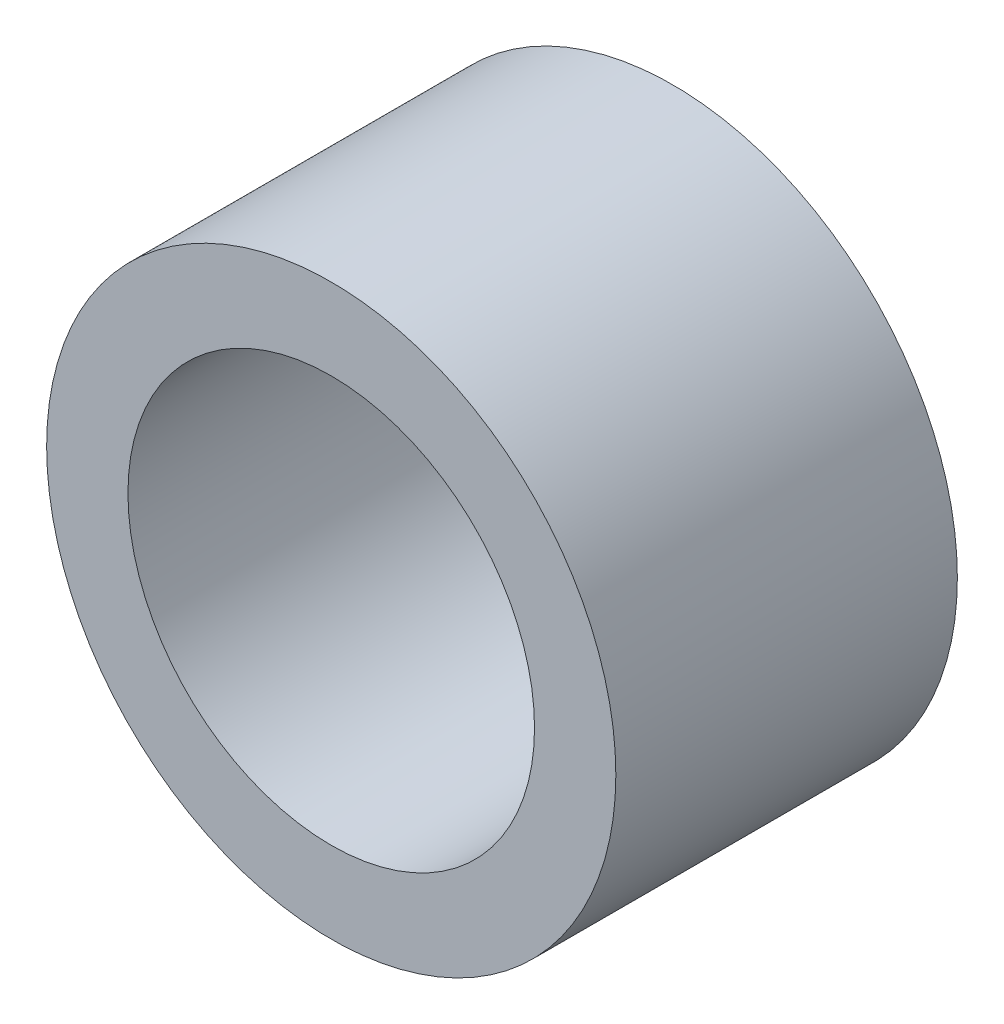
ISO-10303-21;
HEADER;
FILE_DESCRIPTION(('STEP AP214'),'2;1');
FILE_NAME('part.step','',(''),(''),'','','');
FILE_SCHEMA(('AUTOMOTIVE_DESIGN { 1 0 10303 214 1 1 1 1 }'));
ENDSEC;
DATA;
#1=APPLICATION_CONTEXT('core data for automotive mechanical design processes');
#2=APPLICATION_PROTOCOL_DEFINITION('international standard','automotive_design',2000,#1);
#3=PRODUCT_CONTEXT('',#1,'mechanical');
#4=PRODUCT('Part','Part','',(#3));
#5=PRODUCT_RELATED_PRODUCT_CATEGORY('part','',(#4));
#6=PRODUCT_DEFINITION_FORMATION('','',#4);
#7=PRODUCT_DEFINITION_CONTEXT('part definition',#1,'design');
#8=PRODUCT_DEFINITION('design','',#6,#7);
#9=PRODUCT_DEFINITION_SHAPE('','',#8);
#10=(LENGTH_UNIT() NAMED_UNIT(*) SI_UNIT(.MILLI.,.METRE.));
#11=(NAMED_UNIT(*) PLANE_ANGLE_UNIT() SI_UNIT($,.RADIAN.));
#12=(NAMED_UNIT(*) SI_UNIT($,.STERADIAN.) SOLID_ANGLE_UNIT());
#13=UNCERTAINTY_MEASURE_WITH_UNIT(LENGTH_MEASURE(1.E-05),#10,'distance_accuracy_value','');
#14=(GEOMETRIC_REPRESENTATION_CONTEXT(3) GLOBAL_UNCERTAINTY_ASSIGNED_CONTEXT((#13)) GLOBAL_UNIT_ASSIGNED_CONTEXT((#10,
#11,#12)) REPRESENTATION_CONTEXT('',''));
#15=CARTESIAN_POINT('',(0.,0.,0.));
#16=DIRECTION('',(0.,0.,1.));
#17=DIRECTION('',(1.,0.,0.));
#18=AXIS2_PLACEMENT_3D('',#15,#16,#17);
#19=CARTESIAN_POINT('',(0.,0.,21.));
#20=DIRECTION('',(0.,0.,1.));
#21=DIRECTION('',(1.,0.,0.));
#22=AXIS2_PLACEMENT_3D('',#19,#20,#21);
#23=PLANE('',#22);
#24=CARTESIAN_POINT('',(0.,0.,21.));
#25=DIRECTION('',(0.,0.,1.));
#26=DIRECTION('',(1.,0.,0.));
#27=AXIS2_PLACEMENT_3D('',#24,#25,#26);
#28=CIRCLE('',#27,17.5);
#29=CARTESIAN_POINT('',(-17.5,0.,21.));
#30=VERTEX_POINT('',#29);
#31=EDGE_CURVE('E10',#30,#30,#28,.T.);
#32=ORIENTED_EDGE('',*,*,#31,.T.);
#33=EDGE_LOOP('',(#32));
#34=FACE_BOUND('',#33,.T.);
#35=CARTESIAN_POINT('',(0.,0.,21.));
#36=DIRECTION('',(0.,0.,1.));
#37=DIRECTION('',(1.,0.,0.));
#38=AXIS2_PLACEMENT_3D('',#35,#36,#37);
#39=CIRCLE('',#38,12.5);
#40=CARTESIAN_POINT('',(-12.5,0.,21.));
#41=VERTEX_POINT('',#40);
#42=EDGE_CURVE('E42',#41,#41,#39,.T.);
#43=ORIENTED_EDGE('',*,*,#42,.F.);
#44=EDGE_LOOP('',(#43));
#45=FACE_BOUND('',#44,.T.);
#46=ADVANCED_FACE('F31',(#34,#45),#23,.T.);
#47=CARTESIAN_POINT('',(0.,0.,0.));
#48=DIRECTION('',(0.,0.,1.));
#49=DIRECTION('',(1.,0.,0.));
#50=AXIS2_PLACEMENT_3D('',#47,#48,#49);
#51=PLANE('',#50);
#52=CARTESIAN_POINT('',(0.,0.,0.));
#53=DIRECTION('',(0.,0.,1.));
#54=DIRECTION('',(1.,0.,0.));
#55=AXIS2_PLACEMENT_3D('',#52,#53,#54);
#56=CIRCLE('',#55,17.5);
#57=CARTESIAN_POINT('',(-17.5,0.,0.));
#58=VERTEX_POINT('',#57);
#59=EDGE_CURVE('E35',#58,#58,#56,.T.);
#60=ORIENTED_EDGE('',*,*,#59,.F.);
#61=EDGE_LOOP('',(#60));
#62=FACE_BOUND('',#61,.T.);
#63=CARTESIAN_POINT('',(0.,0.,0.));
#64=DIRECTION('',(0.,0.,1.));
#65=DIRECTION('',(1.,0.,0.));
#66=AXIS2_PLACEMENT_3D('',#63,#64,#65);
#67=CIRCLE('',#66,12.5);
#68=CARTESIAN_POINT('',(-12.5,0.,0.));
#69=VERTEX_POINT('',#68);
#70=EDGE_CURVE('E44',#69,#69,#67,.T.);
#71=ORIENTED_EDGE('',*,*,#70,.T.);
#72=EDGE_LOOP('',(#71));
#73=FACE_BOUND('',#72,.T.);
#74=ADVANCED_FACE('F54',(#62,#73),#51,.F.);
#75=CARTESIAN_POINT('',(0.,0.,21.));
#76=DIRECTION('',(0.,0.,-1.));
#77=DIRECTION('',(-1.,0.,0.));
#78=AXIS2_PLACEMENT_3D('',#75,#76,#77);
#79=CYLINDRICAL_SURFACE('',#78,17.5);
#80=CARTESIAN_POINT('',(-17.5,0.,21.));
#81=CARTESIAN_POINT('',(-17.5,0.,20.78125));
#82=CARTESIAN_POINT('',(-17.5,0.,20.5625));
#83=CARTESIAN_POINT('',(-17.5,0.,20.125));
#84=CARTESIAN_POINT('',(-17.5,0.,19.90625));
#85=CARTESIAN_POINT('',(-17.5,0.,19.46875));
#86=CARTESIAN_POINT('',(-17.5,0.,19.25));
#87=CARTESIAN_POINT('',(-17.5,0.,18.8125));
#88=CARTESIAN_POINT('',(-17.5,0.,18.59375));
#89=CARTESIAN_POINT('',(-17.5,0.,18.15625));
#90=CARTESIAN_POINT('',(-17.5,0.,17.9375));
#91=CARTESIAN_POINT('',(-17.5,0.,17.5));
#92=CARTESIAN_POINT('',(-17.5,0.,17.28125));
#93=CARTESIAN_POINT('',(-17.5,0.,16.84375));
#94=CARTESIAN_POINT('',(-17.5,0.,16.625));
#95=CARTESIAN_POINT('',(-17.5,0.,16.1875));
#96=CARTESIAN_POINT('',(-17.5,0.,15.96875));
#97=CARTESIAN_POINT('',(-17.5,0.,15.53125));
#98=CARTESIAN_POINT('',(-17.5,0.,15.3125));
#99=CARTESIAN_POINT('',(-17.5,0.,14.875));
#100=CARTESIAN_POINT('',(-17.5,0.,14.65625));
#101=CARTESIAN_POINT('',(-17.5,0.,14.21875));
#102=CARTESIAN_POINT('',(-17.5,0.,14.));
#103=CARTESIAN_POINT('',(-17.5,0.,13.5625));
#104=CARTESIAN_POINT('',(-17.5,0.,13.34375));
#105=CARTESIAN_POINT('',(-17.5,0.,12.90625));
#106=CARTESIAN_POINT('',(-17.5,0.,12.6875));
#107=CARTESIAN_POINT('',(-17.5,0.,12.25));
#108=CARTESIAN_POINT('',(-17.5,0.,12.03125));
#109=CARTESIAN_POINT('',(-17.5,0.,11.59375));
#110=CARTESIAN_POINT('',(-17.5,0.,11.375));
#111=CARTESIAN_POINT('',(-17.5,0.,10.9375));
#112=CARTESIAN_POINT('',(-17.5,0.,10.71875));
#113=CARTESIAN_POINT('',(-17.5,0.,10.28125));
#114=CARTESIAN_POINT('',(-17.5,0.,10.0625));
#115=CARTESIAN_POINT('',(-17.5,0.,9.625));
#116=CARTESIAN_POINT('',(-17.5,0.,9.40625));
#117=CARTESIAN_POINT('',(-17.5,0.,8.96875));
#118=CARTESIAN_POINT('',(-17.5,0.,8.75));
#119=CARTESIAN_POINT('',(-17.5,0.,8.3125));
#120=CARTESIAN_POINT('',(-17.5,0.,8.09375));
#121=CARTESIAN_POINT('',(-17.5,0.,7.65625));
#122=CARTESIAN_POINT('',(-17.5,0.,7.4375));
#123=CARTESIAN_POINT('',(-17.5,0.,7.));
#124=CARTESIAN_POINT('',(-17.5,0.,6.78125));
#125=CARTESIAN_POINT('',(-17.5,0.,6.34375));
#126=CARTESIAN_POINT('',(-17.5,0.,6.125));
#127=CARTESIAN_POINT('',(-17.5,0.,5.6875));
#128=CARTESIAN_POINT('',(-17.5,0.,5.46875));
#129=CARTESIAN_POINT('',(-17.5,0.,5.03125));
#130=CARTESIAN_POINT('',(-17.5,0.,4.8125));
#131=CARTESIAN_POINT('',(-17.5,0.,4.375));
#132=CARTESIAN_POINT('',(-17.5,0.,4.15625));
#133=CARTESIAN_POINT('',(-17.5,0.,3.71875));
#134=CARTESIAN_POINT('',(-17.5,0.,3.5));
#135=CARTESIAN_POINT('',(-17.5,0.,3.0625));
#136=CARTESIAN_POINT('',(-17.5,0.,2.84375));
#137=CARTESIAN_POINT('',(-17.5,0.,2.40625));
#138=CARTESIAN_POINT('',(-17.5,0.,2.1875));
#139=CARTESIAN_POINT('',(-17.5,0.,1.75));
#140=CARTESIAN_POINT('',(-17.5,0.,1.53125));
#141=CARTESIAN_POINT('',(-17.5,0.,1.09375));
#142=CARTESIAN_POINT('',(-17.5,0.,0.875000000000001));
#143=CARTESIAN_POINT('',(-17.5,0.,0.4375));
#144=CARTESIAN_POINT('',(-17.5,0.,0.21875));
#145=CARTESIAN_POINT('',(-17.5,0.,0.));
#146=B_SPLINE_CURVE_WITH_KNOTS('',3,(#80,#81,#82,#83,#84,#85,#86,#87,#88,#89,#90,#91,#92,#93,
#94,#95,#96,#97,#98,#99,#100,#101,#102,#103,#104,#105,#106,#107,#108,#109,#110,#111,#112,#113,
#114,#115,#116,#117,#118,#119,#120,#121,#122,#123,#124,#125,#126,#127,#128,#129,#130,#131,#132,
#133,#134,#135,#136,#137,#138,#139,#140,#141,#142,#143,#144,#145),.UNSPECIFIED.,.F.,.F.,(4,2,2,
2,2,2,2,2,2,2,2,2,2,2,2,2,2,2,2,2,2,2,2,2,2,2,2,2,2,2,2,2,4),(0.,0.656249999999997,1.3125,
1.96875,2.625,3.28125,3.9375,4.59375,5.25,5.90625,6.5625,7.21875,7.875,8.53125,9.1875,9.84375,
10.5,11.15625,11.8125,12.46875,13.125,13.78125,14.4375,15.09375,15.75,16.40625,17.0625,17.71875,
18.375,19.03125,19.6875,20.34375,21.),.UNSPECIFIED.);
#147=EDGE_CURVE('BSEAM33',#30,#58,#146,.T.);
#148=ORIENTED_EDGE('',*,*,#31,.F.);
#149=ORIENTED_EDGE('',*,*,#59,.T.);
#150=ORIENTED_EDGE('',*,*,#147,.T.);
#151=ORIENTED_EDGE('',*,*,#147,.F.);
#152=EDGE_LOOP('',(#148,#150,#149,#151));
#153=FACE_BOUND('',#152,.T.);
#154=ADVANCED_FACE('F33',(#153),#79,.T.);
#155=CARTESIAN_POINT('',(0.,0.,21.));
#156=DIRECTION('',(0.,0.,-1.));
#157=DIRECTION('',(-1.,0.,0.));
#158=AXIS2_PLACEMENT_3D('',#155,#156,#157);
#159=CYLINDRICAL_SURFACE('',#158,12.5);
#160=CARTESIAN_POINT('',(-12.5,0.,21.));
#161=CARTESIAN_POINT('',(-12.5,0.,20.78125));
#162=CARTESIAN_POINT('',(-12.5,0.,20.5625));
#163=CARTESIAN_POINT('',(-12.5,0.,20.125));
#164=CARTESIAN_POINT('',(-12.5,0.,19.90625));
#165=CARTESIAN_POINT('',(-12.5,0.,19.46875));
#166=CARTESIAN_POINT('',(-12.5,0.,19.25));
#167=CARTESIAN_POINT('',(-12.5,0.,18.8125));
#168=CARTESIAN_POINT('',(-12.5,0.,18.59375));
#169=CARTESIAN_POINT('',(-12.5,0.,18.15625));
#170=CARTESIAN_POINT('',(-12.5,0.,17.9375));
#171=CARTESIAN_POINT('',(-12.5,0.,17.5));
#172=CARTESIAN_POINT('',(-12.5,0.,17.28125));
#173=CARTESIAN_POINT('',(-12.5,0.,16.84375));
#174=CARTESIAN_POINT('',(-12.5,0.,16.625));
#175=CARTESIAN_POINT('',(-12.5,0.,16.1875));
#176=CARTESIAN_POINT('',(-12.5,0.,15.96875));
#177=CARTESIAN_POINT('',(-12.5,0.,15.53125));
#178=CARTESIAN_POINT('',(-12.5,0.,15.3125));
#179=CARTESIAN_POINT('',(-12.5,0.,14.875));
#180=CARTESIAN_POINT('',(-12.5,0.,14.65625));
#181=CARTESIAN_POINT('',(-12.5,0.,14.21875));
#182=CARTESIAN_POINT('',(-12.5,0.,14.));
#183=CARTESIAN_POINT('',(-12.5,0.,13.5625));
#184=CARTESIAN_POINT('',(-12.5,0.,13.34375));
#185=CARTESIAN_POINT('',(-12.5,0.,12.90625));
#186=CARTESIAN_POINT('',(-12.5,0.,12.6875));
#187=CARTESIAN_POINT('',(-12.5,0.,12.25));
#188=CARTESIAN_POINT('',(-12.5,0.,12.03125));
#189=CARTESIAN_POINT('',(-12.5,0.,11.59375));
#190=CARTESIAN_POINT('',(-12.5,0.,11.375));
#191=CARTESIAN_POINT('',(-12.5,0.,10.9375));
#192=CARTESIAN_POINT('',(-12.5,0.,10.71875));
#193=CARTESIAN_POINT('',(-12.5,0.,10.28125));
#194=CARTESIAN_POINT('',(-12.5,0.,10.0625));
#195=CARTESIAN_POINT('',(-12.5,0.,9.625));
#196=CARTESIAN_POINT('',(-12.5,0.,9.40625));
#197=CARTESIAN_POINT('',(-12.5,0.,8.96875));
#198=CARTESIAN_POINT('',(-12.5,0.,8.75));
#199=CARTESIAN_POINT('',(-12.5,0.,8.3125));
#200=CARTESIAN_POINT('',(-12.5,0.,8.09375));
#201=CARTESIAN_POINT('',(-12.5,0.,7.65625));
#202=CARTESIAN_POINT('',(-12.5,0.,7.4375));
#203=CARTESIAN_POINT('',(-12.5,0.,7.));
#204=CARTESIAN_POINT('',(-12.5,0.,6.78125));
#205=CARTESIAN_POINT('',(-12.5,0.,6.34375));
#206=CARTESIAN_POINT('',(-12.5,0.,6.125));
#207=CARTESIAN_POINT('',(-12.5,0.,5.6875));
#208=CARTESIAN_POINT('',(-12.5,0.,5.46875));
#209=CARTESIAN_POINT('',(-12.5,0.,5.03125));
#210=CARTESIAN_POINT('',(-12.5,0.,4.8125));
#211=CARTESIAN_POINT('',(-12.5,0.,4.375));
#212=CARTESIAN_POINT('',(-12.5,0.,4.15625));
#213=CARTESIAN_POINT('',(-12.5,0.,3.71875));
#214=CARTESIAN_POINT('',(-12.5,0.,3.5));
#215=CARTESIAN_POINT('',(-12.5,0.,3.0625));
#216=CARTESIAN_POINT('',(-12.5,0.,2.84375));
#217=CARTESIAN_POINT('',(-12.5,0.,2.40625));
#218=CARTESIAN_POINT('',(-12.5,0.,2.1875));
#219=CARTESIAN_POINT('',(-12.5,0.,1.75));
#220=CARTESIAN_POINT('',(-12.5,0.,1.53125));
#221=CARTESIAN_POINT('',(-12.5,0.,1.09375));
#222=CARTESIAN_POINT('',(-12.5,0.,0.875000000000001));
#223=CARTESIAN_POINT('',(-12.5,0.,0.4375));
#224=CARTESIAN_POINT('',(-12.5,0.,0.21875));
#225=CARTESIAN_POINT('',(-12.5,0.,0.));
#226=B_SPLINE_CURVE_WITH_KNOTS('',3,(#160,#161,#162,#163,#164,#165,#166,#167,#168,#169,#170,
#171,#172,#173,#174,#175,#176,#177,#178,#179,#180,#181,#182,#183,#184,#185,#186,#187,#188,#189,
#190,#191,#192,#193,#194,#195,#196,#197,#198,#199,#200,#201,#202,#203,#204,#205,#206,#207,#208,
#209,#210,#211,#212,#213,#214,#215,#216,#217,#218,#219,#220,#221,#222,#223,#224,#225),
.UNSPECIFIED.,.F.,.F.,(4,2,2,2,2,2,2,2,2,2,2,2,2,2,2,2,2,2,2,2,2,2,2,2,2,2,2,2,2,2,2,2,4),(0.,
0.656249999999997,1.3125,1.96875,2.625,3.28125,3.9375,4.59375,5.25,5.90625,6.5625,7.21875,7.875,
8.53125,9.1875,9.84375,10.5,11.15625,11.8125,12.46875,13.125,13.78125,14.4375,15.09375,15.75,
16.40625,17.0625,17.71875,18.375,19.03125,19.6875,20.34375,21.),.UNSPECIFIED.);
#227=EDGE_CURVE('BSEAM50',#41,#69,#226,.T.);
#228=ORIENTED_EDGE('',*,*,#42,.T.);
#229=ORIENTED_EDGE('',*,*,#70,.F.);
#230=ORIENTED_EDGE('',*,*,#227,.T.);
#231=ORIENTED_EDGE('',*,*,#227,.F.);
#232=EDGE_LOOP('',(#228,#230,#229,#231));
#233=FACE_BOUND('',#232,.T.);
#234=ADVANCED_FACE('F50',(#233),#159,.F.);
#235=CLOSED_SHELL('',(#46,#74,#154,#234));
#236=MANIFOLD_SOLID_BREP('B2',#235);
#237=ADVANCED_BREP_SHAPE_REPRESENTATION('',(#18,#236),#14);
#238=SHAPE_DEFINITION_REPRESENTATION(#9,#237);
ENDSEC;
END-ISO-10303-21;
